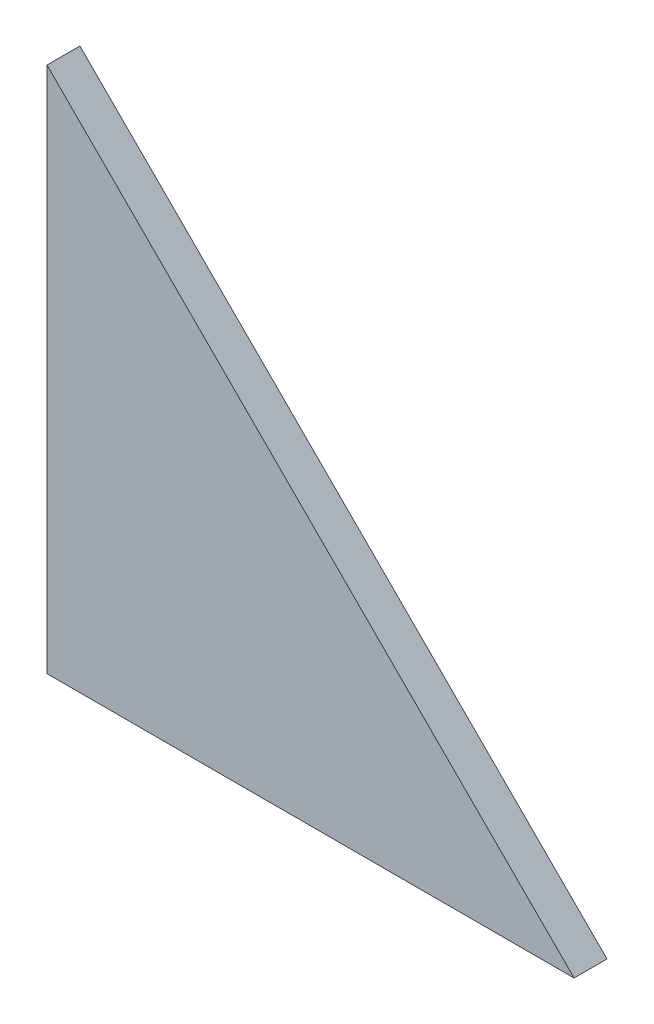
ISO-10303-21;
HEADER;
FILE_DESCRIPTION(('STEP AP214'),'2;1');
FILE_NAME('part.step','',(''),(''),'','','');
FILE_SCHEMA(('AUTOMOTIVE_DESIGN { 1 0 10303 214 1 1 1 1 }'));
ENDSEC;
DATA;
#1=APPLICATION_CONTEXT('core data for automotive mechanical design processes');
#2=APPLICATION_PROTOCOL_DEFINITION('international standard','automotive_design',2000,#1);
#3=PRODUCT_CONTEXT('',#1,'mechanical');
#4=PRODUCT('Part','Part','',(#3));
#5=PRODUCT_RELATED_PRODUCT_CATEGORY('part','',(#4));
#6=PRODUCT_DEFINITION_FORMATION('','',#4);
#7=PRODUCT_DEFINITION_CONTEXT('part definition',#1,'design');
#8=PRODUCT_DEFINITION('design','',#6,#7);
#9=PRODUCT_DEFINITION_SHAPE('','',#8);
#10=(LENGTH_UNIT() NAMED_UNIT(*) SI_UNIT(.MILLI.,.METRE.));
#11=(NAMED_UNIT(*) PLANE_ANGLE_UNIT() SI_UNIT($,.RADIAN.));
#12=(NAMED_UNIT(*) SI_UNIT($,.STERADIAN.) SOLID_ANGLE_UNIT());
#13=UNCERTAINTY_MEASURE_WITH_UNIT(LENGTH_MEASURE(1.E-05),#10,'distance_accuracy_value','');
#14=(GEOMETRIC_REPRESENTATION_CONTEXT(3) GLOBAL_UNCERTAINTY_ASSIGNED_CONTEXT((#13)) GLOBAL_UNIT_ASSIGNED_CONTEXT((#10,
#11,#12)) REPRESENTATION_CONTEXT('',''));
#15=CARTESIAN_POINT('',(0.,0.,0.));
#16=DIRECTION('',(0.,0.,1.));
#17=DIRECTION('',(1.,0.,0.));
#18=AXIS2_PLACEMENT_3D('',#15,#16,#17);
#19=CARTESIAN_POINT('',(0.,0.,9.525));
#20=DIRECTION('',(0.,1.,0.));
#21=DIRECTION('',(0.,0.,1.));
#22=AXIS2_PLACEMENT_3D('',#19,#20,#21);
#23=PLANE('',#22);
#24=DIRECTION('',(1.,0.,0.));
#25=VECTOR('',#24,1.);
#26=CARTESIAN_POINT('',(0.,0.,-9.525));
#27=LINE('',#26,#25);
#28=CARTESIAN_POINT('',(0.,0.,-9.525));
#29=VERTEX_POINT('',#28);
#30=CARTESIAN_POINT('',(304.8,0.,-9.525));
#31=VERTEX_POINT('',#30);
#32=EDGE_CURVE('E99',#29,#31,#27,.T.);
#33=ORIENTED_EDGE('',*,*,#32,.T.);
#34=DIRECTION('',(0.,0.,-1.));
#35=VECTOR('',#34,1.);
#36=CARTESIAN_POINT('',(304.8,0.,9.525));
#37=LINE('',#36,#35);
#38=CARTESIAN_POINT('',(304.8,0.,9.525));
#39=VERTEX_POINT('',#38);
#40=EDGE_CURVE('E11',#39,#31,#37,.T.);
#41=ORIENTED_EDGE('',*,*,#40,.F.);
#42=DIRECTION('',(1.,0.,0.));
#43=VECTOR('',#42,1.);
#44=CARTESIAN_POINT('',(0.,0.,9.525));
#45=LINE('',#44,#43);
#46=CARTESIAN_POINT('',(0.,0.,9.525));
#47=VERTEX_POINT('',#46);
#48=EDGE_CURVE('E91',#47,#39,#45,.T.);
#49=ORIENTED_EDGE('',*,*,#48,.F.);
#50=DIRECTION('',(0.,0.,-1.));
#51=VECTOR('',#50,1.);
#52=CARTESIAN_POINT('',(0.,0.,9.525));
#53=LINE('',#52,#51);
#54=EDGE_CURVE('E100',#47,#29,#53,.T.);
#55=ORIENTED_EDGE('',*,*,#54,.T.);
#56=EDGE_LOOP('',(#33,#41,#49,#55));
#57=FACE_BOUND('',#56,.T.);
#58=ADVANCED_FACE('F43',(#57),#23,.F.);
#59=CARTESIAN_POINT('',(304.8,0.,9.525));
#60=DIRECTION('',(-0.707106781186547,-0.707106781186548,0.));
#61=DIRECTION('',(0.707106781186548,-0.707106781186547,0.));
#62=AXIS2_PLACEMENT_3D('',#59,#60,#61);
#63=PLANE('',#62);
#64=DIRECTION('',(-0.707106781186548,0.707106781186547,0.));
#65=VECTOR('',#64,1.);
#66=CARTESIAN_POINT('',(304.8,0.,-9.525));
#67=LINE('',#66,#65);
#68=CARTESIAN_POINT('',(0.,304.8,-9.525));
#69=VERTEX_POINT('',#68);
#70=EDGE_CURVE('E78',#31,#69,#67,.T.);
#71=ORIENTED_EDGE('',*,*,#70,.T.);
#72=DIRECTION('',(0.,0.,-1.));
#73=VECTOR('',#72,1.);
#74=CARTESIAN_POINT('',(0.,304.8,9.525));
#75=LINE('',#74,#73);
#76=CARTESIAN_POINT('',(0.,304.8,9.525));
#77=VERTEX_POINT('',#76);
#78=EDGE_CURVE('E52',#77,#69,#75,.T.);
#79=ORIENTED_EDGE('',*,*,#78,.F.);
#80=DIRECTION('',(-0.707106781186548,0.707106781186547,0.));
#81=VECTOR('',#80,1.);
#82=CARTESIAN_POINT('',(304.8,0.,9.525));
#83=LINE('',#82,#81);
#84=EDGE_CURVE('E86',#39,#77,#83,.T.);
#85=ORIENTED_EDGE('',*,*,#84,.F.);
#86=ORIENTED_EDGE('',*,*,#40,.T.);
#87=EDGE_LOOP('',(#71,#79,#85,#86));
#88=FACE_BOUND('',#87,.T.);
#89=ADVANCED_FACE('F87',(#88),#63,.F.);
#90=CARTESIAN_POINT('',(0.,304.8,9.525));
#91=DIRECTION('',(1.,0.,0.));
#92=DIRECTION('',(0.,1.,0.));
#93=AXIS2_PLACEMENT_3D('',#90,#91,#92);
#94=PLANE('',#93);
#95=DIRECTION('',(0.,-1.,0.));
#96=VECTOR('',#95,1.);
#97=CARTESIAN_POINT('',(0.,304.8,-9.525));
#98=LINE('',#97,#96);
#99=EDGE_CURVE('E83',#69,#29,#98,.T.);
#100=ORIENTED_EDGE('',*,*,#99,.T.);
#101=ORIENTED_EDGE('',*,*,#54,.F.);
#102=DIRECTION('',(0.,-1.,0.));
#103=VECTOR('',#102,1.);
#104=CARTESIAN_POINT('',(0.,304.8,9.525));
#105=LINE('',#104,#103);
#106=EDGE_CURVE('E62',#77,#47,#105,.T.);
#107=ORIENTED_EDGE('',*,*,#106,.F.);
#108=ORIENTED_EDGE('',*,*,#78,.T.);
#109=EDGE_LOOP('',(#100,#101,#107,#108));
#110=FACE_BOUND('',#109,.T.);
#111=ADVANCED_FACE('F113',(#110),#94,.F.);
#112=CARTESIAN_POINT('',(0.,0.,9.525));
#113=DIRECTION('',(0.,0.,-1.));
#114=DIRECTION('',(-1.,0.,0.));
#115=AXIS2_PLACEMENT_3D('',#112,#113,#114);
#116=PLANE('',#115);
#117=ORIENTED_EDGE('',*,*,#48,.T.);
#118=ORIENTED_EDGE('',*,*,#84,.T.);
#119=ORIENTED_EDGE('',*,*,#106,.T.);
#120=EDGE_LOOP('',(#117,#118,#119));
#121=FACE_BOUND('',#120,.T.);
#122=ADVANCED_FACE('F94',(#121),#116,.F.);
#123=CARTESIAN_POINT('',(0.,0.,-9.525));
#124=DIRECTION('',(0.,0.,-1.));
#125=DIRECTION('',(-1.,0.,0.));
#126=AXIS2_PLACEMENT_3D('',#123,#124,#125);
#127=PLANE('',#126);
#128=ORIENTED_EDGE('',*,*,#32,.F.);
#129=ORIENTED_EDGE('',*,*,#99,.F.);
#130=ORIENTED_EDGE('',*,*,#70,.F.);
#131=EDGE_LOOP('',(#128,#129,#130));
#132=FACE_BOUND('',#131,.T.);
#133=ADVANCED_FACE('F114',(#132),#127,.T.);
#134=CLOSED_SHELL('',(#58,#89,#111,#122,#133));
#135=MANIFOLD_SOLID_BREP('B2',#134);
#136=ADVANCED_BREP_SHAPE_REPRESENTATION('',(#18,#135),#14);
#137=SHAPE_DEFINITION_REPRESENTATION(#9,#136);
ENDSEC;
END-ISO-10303-21;
